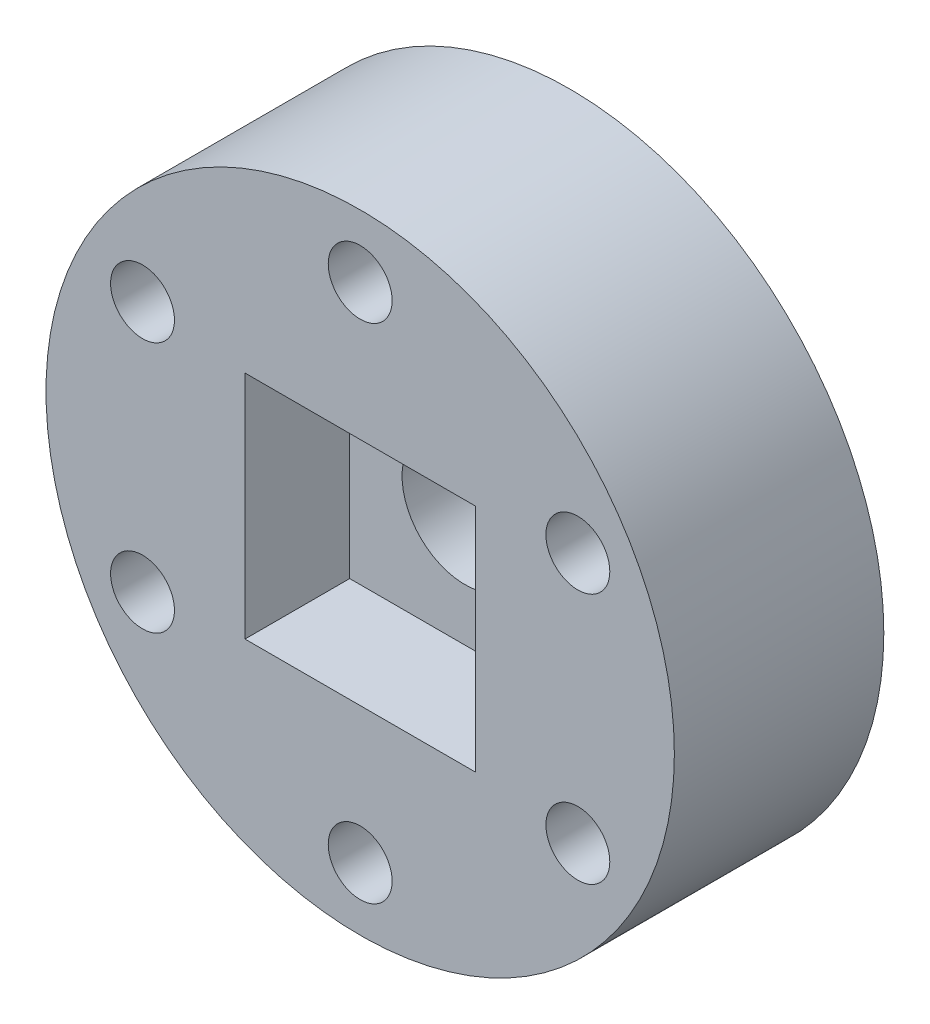
ISO-10303-21;
HEADER;
FILE_DESCRIPTION(('STEP AP214'),'2;1');
FILE_NAME('part.step','',(''),(''),'','','');
FILE_SCHEMA(('AUTOMOTIVE_DESIGN { 1 0 10303 214 1 1 1 1 }'));
ENDSEC;
DATA;
#1=APPLICATION_CONTEXT('core data for automotive mechanical design processes');
#2=APPLICATION_PROTOCOL_DEFINITION('international standard','automotive_design',2000,#1);
#3=PRODUCT_CONTEXT('',#1,'mechanical');
#4=PRODUCT('Part','Part','',(#3));
#5=PRODUCT_RELATED_PRODUCT_CATEGORY('part','',(#4));
#6=PRODUCT_DEFINITION_FORMATION('','',#4);
#7=PRODUCT_DEFINITION_CONTEXT('part definition',#1,'design');
#8=PRODUCT_DEFINITION('design','',#6,#7);
#9=PRODUCT_DEFINITION_SHAPE('','',#8);
#10=(LENGTH_UNIT() NAMED_UNIT(*) SI_UNIT(.MILLI.,.METRE.));
#11=(NAMED_UNIT(*) PLANE_ANGLE_UNIT() SI_UNIT($,.RADIAN.));
#12=(NAMED_UNIT(*) SI_UNIT($,.STERADIAN.) SOLID_ANGLE_UNIT());
#13=UNCERTAINTY_MEASURE_WITH_UNIT(LENGTH_MEASURE(1.E-05),#10,'distance_accuracy_value','');
#14=(GEOMETRIC_REPRESENTATION_CONTEXT(3) GLOBAL_UNCERTAINTY_ASSIGNED_CONTEXT((#13)) GLOBAL_UNIT_ASSIGNED_CONTEXT((#10,
#11,#12)) REPRESENTATION_CONTEXT('',''));
#15=CARTESIAN_POINT('',(0.,0.,0.));
#16=DIRECTION('',(0.,0.,1.));
#17=DIRECTION('',(1.,0.,0.));
#18=AXIS2_PLACEMENT_3D('',#15,#16,#17);
#19=CARTESIAN_POINT('',(0.,24.,20.));
#20=DIRECTION('',(0.,0.,-1.));
#21=DIRECTION('',(-1.,0.,0.));
#22=AXIS2_PLACEMENT_3D('',#19,#20,#21);
#23=CYLINDRICAL_SURFACE('',#22,3.05);
#24=CARTESIAN_POINT('',(0.,24.,20.));
#25=DIRECTION('',(0.,0.,1.));
#26=DIRECTION('',(1.,0.,0.));
#27=AXIS2_PLACEMENT_3D('',#24,#25,#26);
#28=CIRCLE('',#27,3.05);
#29=CARTESIAN_POINT('',(3.05,24.,20.));
#30=VERTEX_POINT('',#29);
#31=EDGE_CURVE('E139',#30,#30,#28,.T.);
#32=ORIENTED_EDGE('',*,*,#31,.T.);
#33=EDGE_LOOP('',(#32));
#34=FACE_BOUND('',#33,.T.);
#35=CARTESIAN_POINT('',(0.,24.,10.));
#36=DIRECTION('',(0.,0.,-1.));
#37=DIRECTION('',(-1.,0.,0.));
#38=AXIS2_PLACEMENT_3D('',#35,#36,#37);
#39=CIRCLE('',#38,3.05);
#40=CARTESIAN_POINT('',(-3.05,24.,10.));
#41=VERTEX_POINT('',#40);
#42=EDGE_CURVE('E43',#41,#41,#39,.T.);
#43=ORIENTED_EDGE('',*,*,#42,.T.);
#44=EDGE_LOOP('',(#43));
#45=FACE_BOUND('',#44,.T.);
#46=ADVANCED_FACE('F39',(#34,#45),#23,.F.);
#47=CARTESIAN_POINT('',(20.7846096908265,12.,20.));
#48=DIRECTION('',(0.,0.,-1.));
#49=DIRECTION('',(-1.,0.,0.));
#50=AXIS2_PLACEMENT_3D('',#47,#48,#49);
#51=CYLINDRICAL_SURFACE('',#50,3.05);
#52=CARTESIAN_POINT('',(20.7846096908265,12.,20.));
#53=DIRECTION('',(0.,0.,1.));
#54=DIRECTION('',(1.,0.,0.));
#55=AXIS2_PLACEMENT_3D('',#52,#53,#54);
#56=CIRCLE('',#55,3.05);
#57=CARTESIAN_POINT('',(23.8346096908265,12.,20.));
#58=VERTEX_POINT('',#57);
#59=EDGE_CURVE('E136',#58,#58,#56,.T.);
#60=ORIENTED_EDGE('',*,*,#59,.T.);
#61=EDGE_LOOP('',(#60));
#62=FACE_BOUND('',#61,.T.);
#63=CARTESIAN_POINT('',(20.7846096908265,12.,10.));
#64=DIRECTION('',(0.,0.,-1.));
#65=DIRECTION('',(-1.,0.,0.));
#66=AXIS2_PLACEMENT_3D('',#63,#64,#65);
#67=CIRCLE('',#66,3.05);
#68=CARTESIAN_POINT('',(17.7346096908265,12.,10.));
#69=VERTEX_POINT('',#68);
#70=EDGE_CURVE('E158',#69,#69,#67,.T.);
#71=ORIENTED_EDGE('',*,*,#70,.T.);
#72=EDGE_LOOP('',(#71));
#73=FACE_BOUND('',#72,.T.);
#74=ADVANCED_FACE('F247',(#62,#73),#51,.F.);
#75=CARTESIAN_POINT('',(20.7846096908265,-12.,20.));
#76=DIRECTION('',(0.,0.,-1.));
#77=DIRECTION('',(-1.,0.,0.));
#78=AXIS2_PLACEMENT_3D('',#75,#76,#77);
#79=CYLINDRICAL_SURFACE('',#78,3.05);
#80=CARTESIAN_POINT('',(20.7846096908265,-12.,20.));
#81=DIRECTION('',(0.,0.,1.));
#82=DIRECTION('',(1.,0.,0.));
#83=AXIS2_PLACEMENT_3D('',#80,#81,#82);
#84=CIRCLE('',#83,3.05);
#85=CARTESIAN_POINT('',(23.8346096908265,-12.,20.));
#86=VERTEX_POINT('',#85);
#87=EDGE_CURVE('E133',#86,#86,#84,.T.);
#88=ORIENTED_EDGE('',*,*,#87,.T.);
#89=EDGE_LOOP('',(#88));
#90=FACE_BOUND('',#89,.T.);
#91=CARTESIAN_POINT('',(20.7846096908265,-12.,10.));
#92=DIRECTION('',(0.,0.,-1.));
#93=DIRECTION('',(-1.,0.,0.));
#94=AXIS2_PLACEMENT_3D('',#91,#92,#93);
#95=CIRCLE('',#94,3.05);
#96=CARTESIAN_POINT('',(17.7346096908265,-12.,10.));
#97=VERTEX_POINT('',#96);
#98=EDGE_CURVE('E156',#97,#97,#95,.T.);
#99=ORIENTED_EDGE('',*,*,#98,.T.);
#100=EDGE_LOOP('',(#99));
#101=FACE_BOUND('',#100,.T.);
#102=ADVANCED_FACE('F253',(#90,#101),#79,.F.);
#103=CARTESIAN_POINT('',(0.,-24.,20.));
#104=DIRECTION('',(0.,0.,-1.));
#105=DIRECTION('',(-1.,0.,0.));
#106=AXIS2_PLACEMENT_3D('',#103,#104,#105);
#107=CYLINDRICAL_SURFACE('',#106,3.05);
#108=CARTESIAN_POINT('',(0.,-24.,20.));
#109=DIRECTION('',(0.,0.,1.));
#110=DIRECTION('',(1.,0.,0.));
#111=AXIS2_PLACEMENT_3D('',#108,#109,#110);
#112=CIRCLE('',#111,3.05);
#113=CARTESIAN_POINT('',(3.05,-24.,20.));
#114=VERTEX_POINT('',#113);
#115=EDGE_CURVE('E130',#114,#114,#112,.T.);
#116=ORIENTED_EDGE('',*,*,#115,.T.);
#117=EDGE_LOOP('',(#116));
#118=FACE_BOUND('',#117,.T.);
#119=CARTESIAN_POINT('',(0.,-24.,10.));
#120=DIRECTION('',(0.,0.,-1.));
#121=DIRECTION('',(-1.,0.,0.));
#122=AXIS2_PLACEMENT_3D('',#119,#120,#121);
#123=CIRCLE('',#122,3.05);
#124=CARTESIAN_POINT('',(-3.05,-24.,10.));
#125=VERTEX_POINT('',#124);
#126=EDGE_CURVE('E153',#125,#125,#123,.T.);
#127=ORIENTED_EDGE('',*,*,#126,.T.);
#128=EDGE_LOOP('',(#127));
#129=FACE_BOUND('',#128,.T.);
#130=ADVANCED_FACE('F281',(#118,#129),#107,.F.);
#131=CARTESIAN_POINT('',(-20.7846096908265,-12.,20.));
#132=DIRECTION('',(0.,0.,-1.));
#133=DIRECTION('',(-1.,0.,0.));
#134=AXIS2_PLACEMENT_3D('',#131,#132,#133);
#135=CYLINDRICAL_SURFACE('',#134,3.05);
#136=CARTESIAN_POINT('',(-20.7846096908265,-12.,20.));
#137=DIRECTION('',(0.,0.,1.));
#138=DIRECTION('',(1.,0.,0.));
#139=AXIS2_PLACEMENT_3D('',#136,#137,#138);
#140=CIRCLE('',#139,3.05);
#141=CARTESIAN_POINT('',(-17.7346096908265,-12.,20.));
#142=VERTEX_POINT('',#141);
#143=EDGE_CURVE('E127',#142,#142,#140,.T.);
#144=ORIENTED_EDGE('',*,*,#143,.T.);
#145=EDGE_LOOP('',(#144));
#146=FACE_BOUND('',#145,.T.);
#147=CARTESIAN_POINT('',(-20.7846096908265,-12.,10.));
#148=DIRECTION('',(0.,0.,-1.));
#149=DIRECTION('',(-1.,0.,0.));
#150=AXIS2_PLACEMENT_3D('',#147,#148,#149);
#151=CIRCLE('',#150,3.05);
#152=CARTESIAN_POINT('',(-23.8346096908265,-12.,10.));
#153=VERTEX_POINT('',#152);
#154=EDGE_CURVE('E149',#153,#153,#151,.T.);
#155=ORIENTED_EDGE('',*,*,#154,.T.);
#156=EDGE_LOOP('',(#155));
#157=FACE_BOUND('',#156,.T.);
#158=ADVANCED_FACE('F278',(#146,#157),#135,.F.);
#159=CARTESIAN_POINT('',(-20.7846096908265,12.,20.));
#160=DIRECTION('',(0.,0.,-1.));
#161=DIRECTION('',(-1.,0.,0.));
#162=AXIS2_PLACEMENT_3D('',#159,#160,#161);
#163=CYLINDRICAL_SURFACE('',#162,3.05);
#164=CARTESIAN_POINT('',(-20.7846096908265,12.,20.));
#165=DIRECTION('',(0.,0.,1.));
#166=DIRECTION('',(1.,0.,0.));
#167=AXIS2_PLACEMENT_3D('',#164,#165,#166);
#168=CIRCLE('',#167,3.05);
#169=CARTESIAN_POINT('',(-17.7346096908265,12.,20.));
#170=VERTEX_POINT('',#169);
#171=EDGE_CURVE('E124',#170,#170,#168,.T.);
#172=ORIENTED_EDGE('',*,*,#171,.T.);
#173=EDGE_LOOP('',(#172));
#174=FACE_BOUND('',#173,.T.);
#175=CARTESIAN_POINT('',(-20.7846096908265,12.,10.));
#176=DIRECTION('',(0.,0.,-1.));
#177=DIRECTION('',(-1.,0.,0.));
#178=AXIS2_PLACEMENT_3D('',#175,#176,#177);
#179=CIRCLE('',#178,3.05);
#180=CARTESIAN_POINT('',(-23.8346096908265,12.,10.));
#181=VERTEX_POINT('',#180);
#182=EDGE_CURVE('E146',#181,#181,#179,.T.);
#183=ORIENTED_EDGE('',*,*,#182,.T.);
#184=EDGE_LOOP('',(#183));
#185=FACE_BOUND('',#184,.T.);
#186=ADVANCED_FACE('F229',(#174,#185),#163,.F.);
#187=CARTESIAN_POINT('',(0.,0.,20.));
#188=DIRECTION('',(0.,0.,-1.));
#189=DIRECTION('',(-1.,0.,0.));
#190=AXIS2_PLACEMENT_3D('',#187,#188,#189);
#191=CYLINDRICAL_SURFACE('',#190,6.);
#192=CARTESIAN_POINT('',(0.,0.,0.));
#193=DIRECTION('',(0.,0.,1.));
#194=DIRECTION('',(1.,0.,0.));
#195=AXIS2_PLACEMENT_3D('',#192,#193,#194);
#196=CIRCLE('',#195,6.);
#197=CARTESIAN_POINT('',(6.,0.,0.));
#198=VERTEX_POINT('',#197);
#199=EDGE_CURVE('E121',#198,#198,#196,.T.);
#200=ORIENTED_EDGE('',*,*,#199,.F.);
#201=EDGE_LOOP('',(#200));
#202=FACE_BOUND('',#201,.T.);
#203=CARTESIAN_POINT('',(0.,0.,10.));
#204=DIRECTION('',(0.,0.,1.));
#205=DIRECTION('',(1.,0.,0.));
#206=AXIS2_PLACEMENT_3D('',#203,#204,#205);
#207=CIRCLE('',#206,6.);
#208=CARTESIAN_POINT('',(6.,0.,10.));
#209=VERTEX_POINT('',#208);
#210=EDGE_CURVE('E118',#209,#209,#207,.T.);
#211=ORIENTED_EDGE('',*,*,#210,.T.);
#212=EDGE_LOOP('',(#211));
#213=FACE_BOUND('',#212,.T.);
#214=ADVANCED_FACE('F226',(#202,#213),#191,.F.);
#215=CARTESIAN_POINT('',(0.,0.,20.));
#216=DIRECTION('',(0.,0.,1.));
#217=DIRECTION('',(1.,0.,0.));
#218=AXIS2_PLACEMENT_3D('',#215,#216,#217);
#219=PLANE('',#218);
#220=DIRECTION('',(0.,-1.,0.));
#221=VECTOR('',#220,1.);
#222=CARTESIAN_POINT('',(-11.,-11.,20.));
#223=LINE('',#222,#221);
#224=CARTESIAN_POINT('',(-11.,11.,20.));
#225=VERTEX_POINT('',#224);
#226=CARTESIAN_POINT('',(-11.,-11.,20.));
#227=VERTEX_POINT('',#226);
#228=EDGE_CURVE('E56',#225,#227,#223,.T.);
#229=ORIENTED_EDGE('',*,*,#228,.F.);
#230=DIRECTION('',(-1.,0.,0.));
#231=VECTOR('',#230,1.);
#232=CARTESIAN_POINT('',(11.,11.,20.));
#233=LINE('',#232,#231);
#234=CARTESIAN_POINT('',(11.,11.,20.));
#235=VERTEX_POINT('',#234);
#236=EDGE_CURVE('E107',#235,#225,#233,.T.);
#237=ORIENTED_EDGE('',*,*,#236,.F.);
#238=DIRECTION('',(0.,1.,0.));
#239=VECTOR('',#238,1.);
#240=CARTESIAN_POINT('',(11.,-11.,20.));
#241=LINE('',#240,#239);
#242=CARTESIAN_POINT('',(11.,-11.,20.));
#243=VERTEX_POINT('',#242);
#244=EDGE_CURVE('E114',#243,#235,#241,.T.);
#245=ORIENTED_EDGE('',*,*,#244,.F.);
#246=DIRECTION('',(1.,0.,0.));
#247=VECTOR('',#246,1.);
#248=CARTESIAN_POINT('',(11.,-11.,20.));
#249=LINE('',#248,#247);
#250=EDGE_CURVE('E91',#227,#243,#249,.T.);
#251=ORIENTED_EDGE('',*,*,#250,.F.);
#252=EDGE_LOOP('',(#229,#237,#245,#251));
#253=FACE_BOUND('',#252,.T.);
#254=ORIENTED_EDGE('',*,*,#171,.F.);
#255=EDGE_LOOP('',(#254));
#256=FACE_BOUND('',#255,.T.);
#257=ORIENTED_EDGE('',*,*,#115,.F.);
#258=EDGE_LOOP('',(#257));
#259=FACE_BOUND('',#258,.T.);
#260=ORIENTED_EDGE('',*,*,#59,.F.);
#261=EDGE_LOOP('',(#260));
#262=FACE_BOUND('',#261,.T.);
#263=CARTESIAN_POINT('',(0.,0.,20.));
#264=DIRECTION('',(0.,0.,1.));
#265=DIRECTION('',(1.,0.,0.));
#266=AXIS2_PLACEMENT_3D('',#263,#264,#265);
#267=CIRCLE('',#266,30.);
#268=CARTESIAN_POINT('',(30.,0.,20.));
#269=VERTEX_POINT('',#268);
#270=EDGE_CURVE('E11',#269,#269,#267,.T.);
#271=ORIENTED_EDGE('',*,*,#270,.T.);
#272=EDGE_LOOP('',(#271));
#273=FACE_BOUND('',#272,.T.);
#274=ORIENTED_EDGE('',*,*,#31,.F.);
#275=EDGE_LOOP('',(#274));
#276=FACE_BOUND('',#275,.T.);
#277=ORIENTED_EDGE('',*,*,#87,.F.);
#278=EDGE_LOOP('',(#277));
#279=FACE_BOUND('',#278,.T.);
#280=ORIENTED_EDGE('',*,*,#143,.F.);
#281=EDGE_LOOP('',(#280));
#282=FACE_BOUND('',#281,.T.);
#283=ADVANCED_FACE('F214',(#253,#256,#259,#262,#273,#276,#279,#282),#219,.T.);
#284=CARTESIAN_POINT('',(0.,0.,0.));
#285=DIRECTION('',(0.,0.,1.));
#286=DIRECTION('',(1.,0.,0.));
#287=AXIS2_PLACEMENT_3D('',#284,#285,#286);
#288=PLANE('',#287);
#289=CARTESIAN_POINT('',(0.,24.,0.));
#290=DIRECTION('',(0.,0.,-1.));
#291=DIRECTION('',(-1.,0.,0.));
#292=AXIS2_PLACEMENT_3D('',#289,#290,#291);
#293=CIRCLE('',#292,5.95);
#294=CARTESIAN_POINT('',(-5.95,24.,0.));
#295=VERTEX_POINT('',#294);
#296=EDGE_CURVE('E174',#295,#295,#293,.T.);
#297=ORIENTED_EDGE('',*,*,#296,.F.);
#298=EDGE_LOOP('',(#297));
#299=FACE_BOUND('',#298,.T.);
#300=CARTESIAN_POINT('',(20.7846096908265,12.,0.));
#301=DIRECTION('',(0.,0.,-1.));
#302=DIRECTION('',(-1.,0.,0.));
#303=AXIS2_PLACEMENT_3D('',#300,#301,#302);
#304=CIRCLE('',#303,5.95);
#305=CARTESIAN_POINT('',(14.8346096908265,12.,0.));
#306=VERTEX_POINT('',#305);
#307=EDGE_CURVE('E184',#306,#306,#304,.T.);
#308=ORIENTED_EDGE('',*,*,#307,.F.);
#309=EDGE_LOOP('',(#308));
#310=FACE_BOUND('',#309,.T.);
#311=CARTESIAN_POINT('',(20.7846096908265,-12.,0.));
#312=DIRECTION('',(0.,0.,-1.));
#313=DIRECTION('',(-1.,0.,0.));
#314=AXIS2_PLACEMENT_3D('',#311,#312,#313);
#315=CIRCLE('',#314,5.95);
#316=CARTESIAN_POINT('',(14.8346096908265,-12.,0.));
#317=VERTEX_POINT('',#316);
#318=EDGE_CURVE('E183',#317,#317,#315,.T.);
#319=ORIENTED_EDGE('',*,*,#318,.F.);
#320=EDGE_LOOP('',(#319));
#321=FACE_BOUND('',#320,.T.);
#322=CARTESIAN_POINT('',(0.,-24.,0.));
#323=DIRECTION('',(0.,0.,-1.));
#324=DIRECTION('',(-1.,0.,0.));
#325=AXIS2_PLACEMENT_3D('',#322,#323,#324);
#326=CIRCLE('',#325,5.95);
#327=CARTESIAN_POINT('',(-5.95,-24.,0.));
#328=VERTEX_POINT('',#327);
#329=EDGE_CURVE('E201',#328,#328,#326,.T.);
#330=ORIENTED_EDGE('',*,*,#329,.F.);
#331=EDGE_LOOP('',(#330));
#332=FACE_BOUND('',#331,.T.);
#333=CARTESIAN_POINT('',(-20.7846096908265,-12.,0.));
#334=DIRECTION('',(0.,0.,-1.));
#335=DIRECTION('',(-1.,0.,0.));
#336=AXIS2_PLACEMENT_3D('',#333,#334,#335);
#337=CIRCLE('',#336,5.95);
#338=CARTESIAN_POINT('',(-26.7346096908265,-12.,0.));
#339=VERTEX_POINT('',#338);
#340=EDGE_CURVE('E195',#339,#339,#337,.T.);
#341=ORIENTED_EDGE('',*,*,#340,.F.);
#342=EDGE_LOOP('',(#341));
#343=FACE_BOUND('',#342,.T.);
#344=CARTESIAN_POINT('',(-20.7846096908265,12.,0.));
#345=DIRECTION('',(0.,0.,-1.));
#346=DIRECTION('',(-1.,0.,0.));
#347=AXIS2_PLACEMENT_3D('',#344,#345,#346);
#348=CIRCLE('',#347,5.95);
#349=CARTESIAN_POINT('',(-26.7346096908265,12.,0.));
#350=VERTEX_POINT('',#349);
#351=EDGE_CURVE('E189',#350,#350,#348,.T.);
#352=ORIENTED_EDGE('',*,*,#351,.F.);
#353=EDGE_LOOP('',(#352));
#354=FACE_BOUND('',#353,.T.);
#355=CARTESIAN_POINT('',(0.,0.,0.));
#356=DIRECTION('',(0.,0.,1.));
#357=DIRECTION('',(1.,0.,0.));
#358=AXIS2_PLACEMENT_3D('',#355,#356,#357);
#359=CIRCLE('',#358,30.);
#360=CARTESIAN_POINT('',(30.,0.,0.));
#361=VERTEX_POINT('',#360);
#362=EDGE_CURVE('E48',#361,#361,#359,.T.);
#363=ORIENTED_EDGE('',*,*,#362,.F.);
#364=EDGE_LOOP('',(#363));
#365=FACE_BOUND('',#364,.T.);
#366=ORIENTED_EDGE('',*,*,#199,.T.);
#367=EDGE_LOOP('',(#366));
#368=FACE_BOUND('',#367,.T.);
#369=ADVANCED_FACE('F211',(#299,#310,#321,#332,#343,#354,#365,#368),#288,.F.);
#370=CARTESIAN_POINT('',(0.,0.,20.));
#371=DIRECTION('',(0.,0.,-1.));
#372=DIRECTION('',(-1.,0.,0.));
#373=AXIS2_PLACEMENT_3D('',#370,#371,#372);
#374=CYLINDRICAL_SURFACE('',#373,30.);
#375=ORIENTED_EDGE('',*,*,#270,.F.);
#376=EDGE_LOOP('',(#375));
#377=FACE_BOUND('',#376,.T.);
#378=ORIENTED_EDGE('',*,*,#362,.T.);
#379=EDGE_LOOP('',(#378));
#380=FACE_BOUND('',#379,.T.);
#381=ADVANCED_FACE('F41',(#377,#380),#374,.T.);
#382=CARTESIAN_POINT('',(-11.,-11.,10.));
#383=DIRECTION('',(-1.,0.,0.));
#384=DIRECTION('',(0.,0.,1.));
#385=AXIS2_PLACEMENT_3D('',#382,#383,#384);
#386=PLANE('',#385);
#387=ORIENTED_EDGE('',*,*,#228,.T.);
#388=DIRECTION('',(0.,0.,1.));
#389=VECTOR('',#388,1.);
#390=CARTESIAN_POINT('',(-11.,-11.,10.));
#391=LINE('',#390,#389);
#392=CARTESIAN_POINT('',(-11.,-11.,10.));
#393=VERTEX_POINT('',#392);
#394=EDGE_CURVE('E79',#393,#227,#391,.T.);
#395=ORIENTED_EDGE('',*,*,#394,.F.);
#396=DIRECTION('',(0.,-1.,0.));
#397=VECTOR('',#396,1.);
#398=CARTESIAN_POINT('',(-11.,-11.,10.));
#399=LINE('',#398,#397);
#400=CARTESIAN_POINT('',(-11.,11.,10.));
#401=VERTEX_POINT('',#400);
#402=EDGE_CURVE('E105',#401,#393,#399,.T.);
#403=ORIENTED_EDGE('',*,*,#402,.F.);
#404=DIRECTION('',(0.,0.,1.));
#405=VECTOR('',#404,1.);
#406=CARTESIAN_POINT('',(-11.,11.,10.));
#407=LINE('',#406,#405);
#408=EDGE_CURVE('E64',#401,#225,#407,.T.);
#409=ORIENTED_EDGE('',*,*,#408,.T.);
#410=EDGE_LOOP('',(#387,#395,#403,#409));
#411=FACE_BOUND('',#410,.T.);
#412=ADVANCED_FACE('F453',(#411),#386,.F.);
#413=CARTESIAN_POINT('',(11.,11.,10.));
#414=DIRECTION('',(0.,1.,0.));
#415=DIRECTION('',(-1.,0.,0.));
#416=AXIS2_PLACEMENT_3D('',#413,#414,#415);
#417=PLANE('',#416);
#418=ORIENTED_EDGE('',*,*,#236,.T.);
#419=ORIENTED_EDGE('',*,*,#408,.F.);
#420=DIRECTION('',(-1.,0.,0.));
#421=VECTOR('',#420,1.);
#422=CARTESIAN_POINT('',(11.,11.,10.));
#423=LINE('',#422,#421);
#424=CARTESIAN_POINT('',(11.,11.,10.));
#425=VERTEX_POINT('',#424);
#426=EDGE_CURVE('E102',#425,#401,#423,.T.);
#427=ORIENTED_EDGE('',*,*,#426,.F.);
#428=DIRECTION('',(0.,0.,1.));
#429=VECTOR('',#428,1.);
#430=CARTESIAN_POINT('',(11.,11.,10.));
#431=LINE('',#430,#429);
#432=EDGE_CURVE('E95',#425,#235,#431,.T.);
#433=ORIENTED_EDGE('',*,*,#432,.T.);
#434=EDGE_LOOP('',(#418,#419,#427,#433));
#435=FACE_BOUND('',#434,.T.);
#436=ADVANCED_FACE('F445',(#435),#417,.F.);
#437=CARTESIAN_POINT('',(11.,-11.,10.));
#438=DIRECTION('',(1.,0.,0.));
#439=DIRECTION('',(0.,1.,0.));
#440=AXIS2_PLACEMENT_3D('',#437,#438,#439);
#441=PLANE('',#440);
#442=ORIENTED_EDGE('',*,*,#244,.T.);
#443=ORIENTED_EDGE('',*,*,#432,.F.);
#444=DIRECTION('',(0.,1.,0.));
#445=VECTOR('',#444,1.);
#446=CARTESIAN_POINT('',(11.,-11.,10.));
#447=LINE('',#446,#445);
#448=CARTESIAN_POINT('',(11.,-11.,10.));
#449=VERTEX_POINT('',#448);
#450=EDGE_CURVE('E98',#449,#425,#447,.T.);
#451=ORIENTED_EDGE('',*,*,#450,.F.);
#452=DIRECTION('',(0.,0.,1.));
#453=VECTOR('',#452,1.);
#454=CARTESIAN_POINT('',(11.,-11.,10.));
#455=LINE('',#454,#453);
#456=EDGE_CURVE('E84',#449,#243,#455,.T.);
#457=ORIENTED_EDGE('',*,*,#456,.T.);
#458=EDGE_LOOP('',(#442,#443,#451,#457));
#459=FACE_BOUND('',#458,.T.);
#460=ADVANCED_FACE('F99',(#459),#441,.F.);
#461=CARTESIAN_POINT('',(11.,-11.,10.));
#462=DIRECTION('',(0.,-1.,0.));
#463=DIRECTION('',(1.,0.,0.));
#464=AXIS2_PLACEMENT_3D('',#461,#462,#463);
#465=PLANE('',#464);
#466=ORIENTED_EDGE('',*,*,#250,.T.);
#467=ORIENTED_EDGE('',*,*,#456,.F.);
#468=DIRECTION('',(1.,0.,0.));
#469=VECTOR('',#468,1.);
#470=CARTESIAN_POINT('',(11.,-11.,10.));
#471=LINE('',#470,#469);
#472=EDGE_CURVE('E88',#393,#449,#471,.T.);
#473=ORIENTED_EDGE('',*,*,#472,.F.);
#474=ORIENTED_EDGE('',*,*,#394,.T.);
#475=EDGE_LOOP('',(#466,#467,#473,#474));
#476=FACE_BOUND('',#475,.T.);
#477=ADVANCED_FACE('F86',(#476),#465,.F.);
#478=CARTESIAN_POINT('',(0.,0.,10.));
#479=DIRECTION('',(0.,0.,1.));
#480=DIRECTION('',(1.,0.,0.));
#481=AXIS2_PLACEMENT_3D('',#478,#479,#480);
#482=PLANE('',#481);
#483=ORIENTED_EDGE('',*,*,#210,.F.);
#484=EDGE_LOOP('',(#483));
#485=FACE_BOUND('',#484,.T.);
#486=ORIENTED_EDGE('',*,*,#402,.T.);
#487=ORIENTED_EDGE('',*,*,#472,.T.);
#488=ORIENTED_EDGE('',*,*,#450,.T.);
#489=ORIENTED_EDGE('',*,*,#426,.T.);
#490=EDGE_LOOP('',(#486,#487,#488,#489));
#491=FACE_BOUND('',#490,.T.);
#492=ADVANCED_FACE('F104',(#485,#491),#482,.T.);
#493=CARTESIAN_POINT('',(-20.7846096908265,12.,10.));
#494=DIRECTION('',(0.,0.,-1.));
#495=DIRECTION('',(-1.,0.,0.));
#496=AXIS2_PLACEMENT_3D('',#493,#494,#495);
#497=CYLINDRICAL_SURFACE('',#496,5.95);
#498=CARTESIAN_POINT('',(-20.7846096908265,12.,10.));
#499=DIRECTION('',(0.,0.,-1.));
#500=DIRECTION('',(-1.,0.,0.));
#501=AXIS2_PLACEMENT_3D('',#498,#499,#500);
#502=CIRCLE('',#501,5.95);
#503=CARTESIAN_POINT('',(-26.7346096908265,12.,10.));
#504=VERTEX_POINT('',#503);
#505=EDGE_CURVE('E177',#504,#504,#502,.T.);
#506=ORIENTED_EDGE('',*,*,#505,.F.);
#507=EDGE_LOOP('',(#506));
#508=FACE_BOUND('',#507,.T.);
#509=ORIENTED_EDGE('',*,*,#351,.T.);
#510=EDGE_LOOP('',(#509));
#511=FACE_BOUND('',#510,.T.);
#512=ADVANCED_FACE('F234',(#508,#511),#497,.F.);
#513=CARTESIAN_POINT('',(-20.7846096908265,12.,10.));
#514=DIRECTION('',(0.,0.,-1.));
#515=DIRECTION('',(-1.,0.,0.));
#516=AXIS2_PLACEMENT_3D('',#513,#514,#515);
#517=PLANE('',#516);
#518=ORIENTED_EDGE('',*,*,#182,.F.);
#519=EDGE_LOOP('',(#518));
#520=FACE_BOUND('',#519,.T.);
#521=ORIENTED_EDGE('',*,*,#505,.T.);
#522=EDGE_LOOP('',(#521));
#523=FACE_BOUND('',#522,.T.);
#524=ADVANCED_FACE('F240',(#520,#523),#517,.T.);
#525=CARTESIAN_POINT('',(-20.7846096908265,-12.,10.));
#526=DIRECTION('',(0.,0.,-1.));
#527=DIRECTION('',(-1.,0.,0.));
#528=AXIS2_PLACEMENT_3D('',#525,#526,#527);
#529=CYLINDRICAL_SURFACE('',#528,5.95);
#530=CARTESIAN_POINT('',(-20.7846096908265,-12.,10.));
#531=DIRECTION('',(0.,0.,-1.));
#532=DIRECTION('',(-1.,0.,0.));
#533=AXIS2_PLACEMENT_3D('',#530,#531,#532);
#534=CIRCLE('',#533,5.95);
#535=CARTESIAN_POINT('',(-26.7346096908265,-12.,10.));
#536=VERTEX_POINT('',#535);
#537=EDGE_CURVE('E192',#536,#536,#534,.T.);
#538=ORIENTED_EDGE('',*,*,#537,.F.);
#539=EDGE_LOOP('',(#538));
#540=FACE_BOUND('',#539,.T.);
#541=ORIENTED_EDGE('',*,*,#340,.T.);
#542=EDGE_LOOP('',(#541));
#543=FACE_BOUND('',#542,.T.);
#544=ADVANCED_FACE('F289',(#540,#543),#529,.F.);
#545=CARTESIAN_POINT('',(-20.7846096908265,-12.,10.));
#546=DIRECTION('',(0.,0.,-1.));
#547=DIRECTION('',(-1.,0.,0.));
#548=AXIS2_PLACEMENT_3D('',#545,#546,#547);
#549=PLANE('',#548);
#550=ORIENTED_EDGE('',*,*,#154,.F.);
#551=EDGE_LOOP('',(#550));
#552=FACE_BOUND('',#551,.T.);
#553=ORIENTED_EDGE('',*,*,#537,.T.);
#554=EDGE_LOOP('',(#553));
#555=FACE_BOUND('',#554,.T.);
#556=ADVANCED_FACE('F285',(#552,#555),#549,.T.);
#557=CARTESIAN_POINT('',(0.,-24.,10.));
#558=DIRECTION('',(0.,0.,-1.));
#559=DIRECTION('',(-1.,0.,0.));
#560=AXIS2_PLACEMENT_3D('',#557,#558,#559);
#561=CYLINDRICAL_SURFACE('',#560,5.95);
#562=CARTESIAN_POINT('',(0.,-24.,10.));
#563=DIRECTION('',(0.,0.,-1.));
#564=DIRECTION('',(-1.,0.,0.));
#565=AXIS2_PLACEMENT_3D('',#562,#563,#564);
#566=CIRCLE('',#565,5.95);
#567=CARTESIAN_POINT('',(-5.95,-24.,10.));
#568=VERTEX_POINT('',#567);
#569=EDGE_CURVE('E198',#568,#568,#566,.T.);
#570=ORIENTED_EDGE('',*,*,#569,.F.);
#571=EDGE_LOOP('',(#570));
#572=FACE_BOUND('',#571,.T.);
#573=ORIENTED_EDGE('',*,*,#329,.T.);
#574=EDGE_LOOP('',(#573));
#575=FACE_BOUND('',#574,.T.);
#576=ADVANCED_FACE('F288',(#572,#575),#561,.F.);
#577=CARTESIAN_POINT('',(0.,-24.,10.));
#578=DIRECTION('',(0.,0.,-1.));
#579=DIRECTION('',(-1.,0.,0.));
#580=AXIS2_PLACEMENT_3D('',#577,#578,#579);
#581=PLANE('',#580);
#582=ORIENTED_EDGE('',*,*,#126,.F.);
#583=EDGE_LOOP('',(#582));
#584=FACE_BOUND('',#583,.T.);
#585=ORIENTED_EDGE('',*,*,#569,.T.);
#586=EDGE_LOOP('',(#585));
#587=FACE_BOUND('',#586,.T.);
#588=ADVANCED_FACE('F302',(#584,#587),#581,.T.);
#589=CARTESIAN_POINT('',(20.7846096908265,-12.,10.));
#590=DIRECTION('',(0.,0.,-1.));
#591=DIRECTION('',(-1.,0.,0.));
#592=AXIS2_PLACEMENT_3D('',#589,#590,#591);
#593=CYLINDRICAL_SURFACE('',#592,5.95);
#594=CARTESIAN_POINT('',(20.7846096908265,-12.,10.));
#595=DIRECTION('',(0.,0.,-1.));
#596=DIRECTION('',(-1.,0.,0.));
#597=AXIS2_PLACEMENT_3D('',#594,#595,#596);
#598=CIRCLE('',#597,5.95);
#599=CARTESIAN_POINT('',(14.8346096908265,-12.,10.));
#600=VERTEX_POINT('',#599);
#601=EDGE_CURVE('E204',#600,#600,#598,.T.);
#602=ORIENTED_EDGE('',*,*,#601,.F.);
#603=EDGE_LOOP('',(#602));
#604=FACE_BOUND('',#603,.T.);
#605=ORIENTED_EDGE('',*,*,#318,.T.);
#606=EDGE_LOOP('',(#605));
#607=FACE_BOUND('',#606,.T.);
#608=ADVANCED_FACE('F209',(#604,#607),#593,.F.);
#609=CARTESIAN_POINT('',(20.7846096908265,-12.,10.));
#610=DIRECTION('',(0.,0.,-1.));
#611=DIRECTION('',(-1.,0.,0.));
#612=AXIS2_PLACEMENT_3D('',#609,#610,#611);
#613=PLANE('',#612);
#614=ORIENTED_EDGE('',*,*,#98,.F.);
#615=EDGE_LOOP('',(#614));
#616=FACE_BOUND('',#615,.T.);
#617=ORIENTED_EDGE('',*,*,#601,.T.);
#618=EDGE_LOOP('',(#617));
#619=FACE_BOUND('',#618,.T.);
#620=ADVANCED_FACE('F309',(#616,#619),#613,.T.);
#621=CARTESIAN_POINT('',(20.7846096908265,12.,10.));
#622=DIRECTION('',(0.,0.,-1.));
#623=DIRECTION('',(-1.,0.,0.));
#624=AXIS2_PLACEMENT_3D('',#621,#622,#623);
#625=CYLINDRICAL_SURFACE('',#624,5.95);
#626=CARTESIAN_POINT('',(20.7846096908265,12.,10.));
#627=DIRECTION('',(0.,0.,-1.));
#628=DIRECTION('',(-1.,0.,0.));
#629=AXIS2_PLACEMENT_3D('',#626,#627,#628);
#630=CIRCLE('',#629,5.95);
#631=CARTESIAN_POINT('',(14.8346096908265,12.,10.));
#632=VERTEX_POINT('',#631);
#633=EDGE_CURVE('E180',#632,#632,#630,.T.);
#634=ORIENTED_EDGE('',*,*,#633,.F.);
#635=EDGE_LOOP('',(#634));
#636=FACE_BOUND('',#635,.T.);
#637=ORIENTED_EDGE('',*,*,#307,.T.);
#638=EDGE_LOOP('',(#637));
#639=FACE_BOUND('',#638,.T.);
#640=ADVANCED_FACE('F311',(#636,#639),#625,.F.);
#641=CARTESIAN_POINT('',(20.7846096908265,12.,10.));
#642=DIRECTION('',(0.,0.,-1.));
#643=DIRECTION('',(-1.,0.,0.));
#644=AXIS2_PLACEMENT_3D('',#641,#642,#643);
#645=PLANE('',#644);
#646=ORIENTED_EDGE('',*,*,#70,.F.);
#647=EDGE_LOOP('',(#646));
#648=FACE_BOUND('',#647,.T.);
#649=ORIENTED_EDGE('',*,*,#633,.T.);
#650=EDGE_LOOP('',(#649));
#651=FACE_BOUND('',#650,.T.);
#652=ADVANCED_FACE('F331',(#648,#651),#645,.T.);
#653=CARTESIAN_POINT('',(0.,24.,10.));
#654=DIRECTION('',(0.,0.,-1.));
#655=DIRECTION('',(-1.,0.,0.));
#656=AXIS2_PLACEMENT_3D('',#653,#654,#655);
#657=CYLINDRICAL_SURFACE('',#656,5.95);
#658=CARTESIAN_POINT('',(0.,24.,10.));
#659=DIRECTION('',(0.,0.,-1.));
#660=DIRECTION('',(-1.,0.,0.));
#661=AXIS2_PLACEMENT_3D('',#658,#659,#660);
#662=CIRCLE('',#661,5.95);
#663=CARTESIAN_POINT('',(-5.95,24.,10.));
#664=VERTEX_POINT('',#663);
#665=EDGE_CURVE('E150',#664,#664,#662,.T.);
#666=ORIENTED_EDGE('',*,*,#665,.F.);
#667=EDGE_LOOP('',(#666));
#668=FACE_BOUND('',#667,.T.);
#669=ORIENTED_EDGE('',*,*,#296,.T.);
#670=EDGE_LOOP('',(#669));
#671=FACE_BOUND('',#670,.T.);
#672=ADVANCED_FACE('F169',(#668,#671),#657,.F.);
#673=CARTESIAN_POINT('',(0.,24.,10.));
#674=DIRECTION('',(0.,0.,-1.));
#675=DIRECTION('',(-1.,0.,0.));
#676=AXIS2_PLACEMENT_3D('',#673,#674,#675);
#677=PLANE('',#676);
#678=ORIENTED_EDGE('',*,*,#42,.F.);
#679=EDGE_LOOP('',(#678));
#680=FACE_BOUND('',#679,.T.);
#681=ORIENTED_EDGE('',*,*,#665,.T.);
#682=EDGE_LOOP('',(#681));
#683=FACE_BOUND('',#682,.T.);
#684=ADVANCED_FACE('F166',(#680,#683),#677,.T.);
#685=CLOSED_SHELL('',(#46,#74,#102,#130,#158,#186,#214,#283,#369,#381,#412,#436,#460,#477,#492,
#512,#524,#544,#556,#576,#588,#608,#620,#640,#652,#672,#684));
#686=MANIFOLD_SOLID_BREP('B2',#685);
#687=ADVANCED_BREP_SHAPE_REPRESENTATION('',(#18,#686),#14);
#688=SHAPE_DEFINITION_REPRESENTATION(#9,#687);
ENDSEC;
END-ISO-10303-21;
